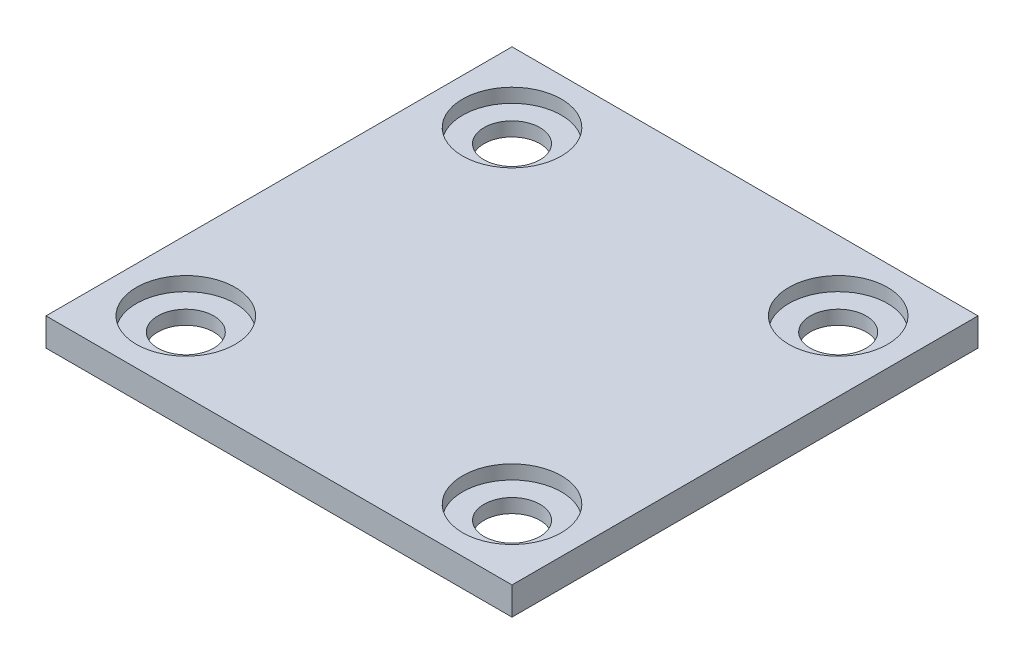
ISO-10303-21;
HEADER;
FILE_DESCRIPTION(('STEP AP214'),'2;1');
FILE_NAME('part.step','',(''),(''),'','','');
FILE_SCHEMA(('AUTOMOTIVE_DESIGN { 1 0 10303 214 1 1 1 1 }'));
ENDSEC;
DATA;
#1=APPLICATION_CONTEXT('core data for automotive mechanical design processes');
#2=APPLICATION_PROTOCOL_DEFINITION('international standard','automotive_design',2000,#1);
#3=PRODUCT_CONTEXT('',#1,'mechanical');
#4=PRODUCT('Part','Part','',(#3));
#5=PRODUCT_RELATED_PRODUCT_CATEGORY('part','',(#4));
#6=PRODUCT_DEFINITION_FORMATION('','',#4);
#7=PRODUCT_DEFINITION_CONTEXT('part definition',#1,'design');
#8=PRODUCT_DEFINITION('design','',#6,#7);
#9=PRODUCT_DEFINITION_SHAPE('','',#8);
#10=(LENGTH_UNIT() NAMED_UNIT(*) SI_UNIT(.MILLI.,.METRE.));
#11=(NAMED_UNIT(*) PLANE_ANGLE_UNIT() SI_UNIT($,.RADIAN.));
#12=(NAMED_UNIT(*) SI_UNIT($,.STERADIAN.) SOLID_ANGLE_UNIT());
#13=UNCERTAINTY_MEASURE_WITH_UNIT(LENGTH_MEASURE(1.E-05),#10,'distance_accuracy_value','');
#14=(GEOMETRIC_REPRESENTATION_CONTEXT(3) GLOBAL_UNCERTAINTY_ASSIGNED_CONTEXT((#13)) GLOBAL_UNIT_ASSIGNED_CONTEXT((#10,
#11,#12)) REPRESENTATION_CONTEXT('',''));
#15=CARTESIAN_POINT('',(0.,0.,0.));
#16=DIRECTION('',(0.,0.,1.));
#17=DIRECTION('',(1.,0.,0.));
#18=AXIS2_PLACEMENT_3D('',#15,#16,#17);
#19=CARTESIAN_POINT('',(-17.5,3.,-17.5));
#20=DIRECTION('',(0.,-1.,0.));
#21=DIRECTION('',(0.,0.,-1.));
#22=AXIS2_PLACEMENT_3D('',#19,#20,#21);
#23=CYLINDRICAL_SURFACE('',#22,3.);
#24=CARTESIAN_POINT('',(-17.5,0.,-17.5));
#25=DIRECTION('',(0.,1.,0.));
#26=DIRECTION('',(0.,0.,1.));
#27=AXIS2_PLACEMENT_3D('',#24,#25,#26);
#28=CIRCLE('',#27,3.);
#29=CARTESIAN_POINT('',(-17.5,0.,-14.5));
#30=VERTEX_POINT('',#29);
#31=EDGE_CURVE('E119',#30,#30,#28,.T.);
#32=ORIENTED_EDGE('',*,*,#31,.F.);
#33=EDGE_LOOP('',(#32));
#34=FACE_BOUND('',#33,.T.);
#35=CARTESIAN_POINT('',(-17.5,1.5,-17.5));
#36=DIRECTION('',(0.,1.,0.));
#37=DIRECTION('',(0.,0.,1.));
#38=AXIS2_PLACEMENT_3D('',#35,#36,#37);
#39=CIRCLE('',#38,3.);
#40=CARTESIAN_POINT('',(-17.5,1.5,-14.5));
#41=VERTEX_POINT('',#40);
#42=EDGE_CURVE('E47',#41,#41,#39,.T.);
#43=ORIENTED_EDGE('',*,*,#42,.T.);
#44=EDGE_LOOP('',(#43));
#45=FACE_BOUND('',#44,.T.);
#46=ADVANCED_FACE('F43',(#34,#45),#23,.F.);
#47=CARTESIAN_POINT('',(17.5,3.,-17.5));
#48=DIRECTION('',(0.,-1.,0.));
#49=DIRECTION('',(0.,0.,-1.));
#50=AXIS2_PLACEMENT_3D('',#47,#48,#49);
#51=CYLINDRICAL_SURFACE('',#50,3.);
#52=CARTESIAN_POINT('',(17.5,0.,-17.5));
#53=DIRECTION('',(0.,1.,0.));
#54=DIRECTION('',(0.,0.,1.));
#55=AXIS2_PLACEMENT_3D('',#52,#53,#54);
#56=CIRCLE('',#55,3.);
#57=CARTESIAN_POINT('',(17.5,0.,-14.5));
#58=VERTEX_POINT('',#57);
#59=EDGE_CURVE('E156',#58,#58,#56,.T.);
#60=ORIENTED_EDGE('',*,*,#59,.F.);
#61=EDGE_LOOP('',(#60));
#62=FACE_BOUND('',#61,.T.);
#63=CARTESIAN_POINT('',(17.5,1.5,-17.5));
#64=DIRECTION('',(0.,1.,0.));
#65=DIRECTION('',(0.,0.,1.));
#66=AXIS2_PLACEMENT_3D('',#63,#64,#65);
#67=CIRCLE('',#66,3.);
#68=CARTESIAN_POINT('',(17.5,1.5,-14.5));
#69=VERTEX_POINT('',#68);
#70=EDGE_CURVE('E138',#69,#69,#67,.T.);
#71=ORIENTED_EDGE('',*,*,#70,.T.);
#72=EDGE_LOOP('',(#71));
#73=FACE_BOUND('',#72,.T.);
#74=ADVANCED_FACE('F174',(#62,#73),#51,.F.);
#75=CARTESIAN_POINT('',(-17.5,3.,17.5));
#76=DIRECTION('',(0.,-1.,0.));
#77=DIRECTION('',(0.,0.,-1.));
#78=AXIS2_PLACEMENT_3D('',#75,#76,#77);
#79=CYLINDRICAL_SURFACE('',#78,3.);
#80=CARTESIAN_POINT('',(-17.5,0.,17.5));
#81=DIRECTION('',(0.,1.,0.));
#82=DIRECTION('',(0.,0.,1.));
#83=AXIS2_PLACEMENT_3D('',#80,#81,#82);
#84=CIRCLE('',#83,3.);
#85=CARTESIAN_POINT('',(-17.5,0.,20.5));
#86=VERTEX_POINT('',#85);
#87=EDGE_CURVE('E150',#86,#86,#84,.T.);
#88=ORIENTED_EDGE('',*,*,#87,.F.);
#89=EDGE_LOOP('',(#88));
#90=FACE_BOUND('',#89,.T.);
#91=CARTESIAN_POINT('',(-17.5,1.5,17.5));
#92=DIRECTION('',(0.,1.,0.));
#93=DIRECTION('',(0.,0.,1.));
#94=AXIS2_PLACEMENT_3D('',#91,#92,#93);
#95=CIRCLE('',#94,3.);
#96=CARTESIAN_POINT('',(-17.5,1.5,20.5));
#97=VERTEX_POINT('',#96);
#98=EDGE_CURVE('E134',#97,#97,#95,.T.);
#99=ORIENTED_EDGE('',*,*,#98,.T.);
#100=EDGE_LOOP('',(#99));
#101=FACE_BOUND('',#100,.T.);
#102=ADVANCED_FACE('F179',(#90,#101),#79,.F.);
#103=CARTESIAN_POINT('',(17.5,3.,17.5));
#104=DIRECTION('',(0.,-1.,0.));
#105=DIRECTION('',(0.,0.,-1.));
#106=AXIS2_PLACEMENT_3D('',#103,#104,#105);
#107=CYLINDRICAL_SURFACE('',#106,3.);
#108=CARTESIAN_POINT('',(17.5,0.,17.5));
#109=DIRECTION('',(0.,1.,0.));
#110=DIRECTION('',(0.,0.,1.));
#111=AXIS2_PLACEMENT_3D('',#108,#109,#110);
#112=CIRCLE('',#111,3.);
#113=CARTESIAN_POINT('',(17.5,0.,20.5));
#114=VERTEX_POINT('',#113);
#115=EDGE_CURVE('E145',#114,#114,#112,.T.);
#116=ORIENTED_EDGE('',*,*,#115,.F.);
#117=EDGE_LOOP('',(#116));
#118=FACE_BOUND('',#117,.T.);
#119=CARTESIAN_POINT('',(17.5,1.5,17.5));
#120=DIRECTION('',(0.,1.,0.));
#121=DIRECTION('',(0.,0.,1.));
#122=AXIS2_PLACEMENT_3D('',#119,#120,#121);
#123=CIRCLE('',#122,3.);
#124=CARTESIAN_POINT('',(17.5,1.5,20.5));
#125=VERTEX_POINT('',#124);
#126=EDGE_CURVE('E130',#125,#125,#123,.T.);
#127=ORIENTED_EDGE('',*,*,#126,.T.);
#128=EDGE_LOOP('',(#127));
#129=FACE_BOUND('',#128,.T.);
#130=ADVANCED_FACE('F186',(#118,#129),#107,.F.);
#131=CARTESIAN_POINT('',(0.,3.,0.));
#132=DIRECTION('',(0.,-1.,0.));
#133=DIRECTION('',(0.,0.,-1.));
#134=AXIS2_PLACEMENT_3D('',#131,#132,#133);
#135=PLANE('',#134);
#136=CARTESIAN_POINT('',(-17.5,3.,17.5));
#137=DIRECTION('',(0.,1.,0.));
#138=DIRECTION('',(0.,0.,1.));
#139=AXIS2_PLACEMENT_3D('',#136,#137,#138);
#140=CIRCLE('',#139,5.3);
#141=CARTESIAN_POINT('',(-17.5,3.,22.8));
#142=VERTEX_POINT('',#141);
#143=EDGE_CURVE('E392',#142,#142,#140,.T.);
#144=ORIENTED_EDGE('',*,*,#143,.F.);
#145=EDGE_LOOP('',(#144));
#146=FACE_BOUND('',#145,.T.);
#147=CARTESIAN_POINT('',(17.5,3.,17.5));
#148=DIRECTION('',(0.,1.,0.));
#149=DIRECTION('',(0.,0.,1.));
#150=AXIS2_PLACEMENT_3D('',#147,#148,#149);
#151=CIRCLE('',#150,5.3);
#152=CARTESIAN_POINT('',(17.5,3.,22.8));
#153=VERTEX_POINT('',#152);
#154=EDGE_CURVE('E400',#153,#153,#151,.T.);
#155=ORIENTED_EDGE('',*,*,#154,.F.);
#156=EDGE_LOOP('',(#155));
#157=FACE_BOUND('',#156,.T.);
#158=CARTESIAN_POINT('',(17.5,3.,-17.5));
#159=DIRECTION('',(0.,1.,0.));
#160=DIRECTION('',(0.,0.,1.));
#161=AXIS2_PLACEMENT_3D('',#158,#159,#160);
#162=CIRCLE('',#161,5.3);
#163=CARTESIAN_POINT('',(17.5,3.,-12.2));
#164=VERTEX_POINT('',#163);
#165=EDGE_CURVE('E386',#164,#164,#162,.T.);
#166=ORIENTED_EDGE('',*,*,#165,.F.);
#167=EDGE_LOOP('',(#166));
#168=FACE_BOUND('',#167,.T.);
#169=CARTESIAN_POINT('',(-17.5,3.,-17.5));
#170=DIRECTION('',(0.,1.,0.));
#171=DIRECTION('',(0.,0.,1.));
#172=AXIS2_PLACEMENT_3D('',#169,#170,#171);
#173=CIRCLE('',#172,5.3);
#174=CARTESIAN_POINT('',(-17.5,3.,-12.2));
#175=VERTEX_POINT('',#174);
#176=EDGE_CURVE('E159',#175,#175,#173,.T.);
#177=ORIENTED_EDGE('',*,*,#176,.F.);
#178=EDGE_LOOP('',(#177));
#179=FACE_BOUND('',#178,.T.);
#180=DIRECTION('',(0.,0.,-1.));
#181=VECTOR('',#180,1.);
#182=CARTESIAN_POINT('',(25.,3.,25.));
#183=LINE('',#182,#181);
#184=CARTESIAN_POINT('',(25.,3.,25.));
#185=VERTEX_POINT('',#184);
#186=CARTESIAN_POINT('',(25.,3.,-25.));
#187=VERTEX_POINT('',#186);
#188=EDGE_CURVE('E98',#185,#187,#183,.T.);
#189=ORIENTED_EDGE('',*,*,#188,.T.);
#190=DIRECTION('',(-1.,0.,0.));
#191=VECTOR('',#190,1.);
#192=CARTESIAN_POINT('',(-25.,3.,-25.));
#193=LINE('',#192,#191);
#194=CARTESIAN_POINT('',(-25.,3.,-25.));
#195=VERTEX_POINT('',#194);
#196=EDGE_CURVE('E93',#187,#195,#193,.T.);
#197=ORIENTED_EDGE('',*,*,#196,.T.);
#198=DIRECTION('',(0.,0.,1.));
#199=VECTOR('',#198,1.);
#200=CARTESIAN_POINT('',(-25.,3.,25.));
#201=LINE('',#200,#199);
#202=CARTESIAN_POINT('',(-25.,3.,25.));
#203=VERTEX_POINT('',#202);
#204=EDGE_CURVE('E96',#195,#203,#201,.T.);
#205=ORIENTED_EDGE('',*,*,#204,.T.);
#206=DIRECTION('',(1.,0.,0.));
#207=VECTOR('',#206,1.);
#208=CARTESIAN_POINT('',(-25.,3.,25.));
#209=LINE('',#208,#207);
#210=EDGE_CURVE('E63',#203,#185,#209,.T.);
#211=ORIENTED_EDGE('',*,*,#210,.T.);
#212=EDGE_LOOP('',(#189,#197,#205,#211));
#213=FACE_BOUND('',#212,.T.);
#214=ADVANCED_FACE('F94',(#146,#157,#168,#179,#213),#135,.F.);
#215=CARTESIAN_POINT('',(0.,0.,0.));
#216=DIRECTION('',(0.,-1.,0.));
#217=DIRECTION('',(0.,0.,-1.));
#218=AXIS2_PLACEMENT_3D('',#215,#216,#217);
#219=PLANE('',#218);
#220=ORIENTED_EDGE('',*,*,#87,.T.);
#221=EDGE_LOOP('',(#220));
#222=FACE_BOUND('',#221,.T.);
#223=ORIENTED_EDGE('',*,*,#31,.T.);
#224=EDGE_LOOP('',(#223));
#225=FACE_BOUND('',#224,.T.);
#226=DIRECTION('',(0.,0.,-1.));
#227=VECTOR('',#226,1.);
#228=CARTESIAN_POINT('',(25.,0.,25.));
#229=LINE('',#228,#227);
#230=CARTESIAN_POINT('',(25.,0.,25.));
#231=VERTEX_POINT('',#230);
#232=CARTESIAN_POINT('',(25.,0.,-25.));
#233=VERTEX_POINT('',#232);
#234=EDGE_CURVE('E115',#231,#233,#229,.T.);
#235=ORIENTED_EDGE('',*,*,#234,.F.);
#236=DIRECTION('',(1.,0.,0.));
#237=VECTOR('',#236,1.);
#238=CARTESIAN_POINT('',(-25.,0.,25.));
#239=LINE('',#238,#237);
#240=CARTESIAN_POINT('',(-25.,0.,25.));
#241=VERTEX_POINT('',#240);
#242=EDGE_CURVE('E86',#241,#231,#239,.T.);
#243=ORIENTED_EDGE('',*,*,#242,.F.);
#244=DIRECTION('',(0.,0.,1.));
#245=VECTOR('',#244,1.);
#246=CARTESIAN_POINT('',(-25.,0.,25.));
#247=LINE('',#246,#245);
#248=CARTESIAN_POINT('',(-25.,0.,-25.));
#249=VERTEX_POINT('',#248);
#250=EDGE_CURVE('E80',#249,#241,#247,.T.);
#251=ORIENTED_EDGE('',*,*,#250,.F.);
#252=DIRECTION('',(-1.,0.,0.));
#253=VECTOR('',#252,1.);
#254=CARTESIAN_POINT('',(-25.,0.,-25.));
#255=LINE('',#254,#253);
#256=EDGE_CURVE('E103',#233,#249,#255,.T.);
#257=ORIENTED_EDGE('',*,*,#256,.F.);
#258=EDGE_LOOP('',(#235,#243,#251,#257));
#259=FACE_BOUND('',#258,.T.);
#260=ORIENTED_EDGE('',*,*,#59,.T.);
#261=EDGE_LOOP('',(#260));
#262=FACE_BOUND('',#261,.T.);
#263=ORIENTED_EDGE('',*,*,#115,.T.);
#264=EDGE_LOOP('',(#263));
#265=FACE_BOUND('',#264,.T.);
#266=ADVANCED_FACE('F170',(#222,#225,#259,#262,#265),#219,.T.);
#267=CARTESIAN_POINT('',(25.,3.,25.));
#268=DIRECTION('',(-1.,0.,0.));
#269=DIRECTION('',(0.,0.,1.));
#270=AXIS2_PLACEMENT_3D('',#267,#268,#269);
#271=PLANE('',#270);
#272=ORIENTED_EDGE('',*,*,#234,.T.);
#273=DIRECTION('',(0.,-1.,0.));
#274=VECTOR('',#273,1.);
#275=CARTESIAN_POINT('',(25.,3.,-25.));
#276=LINE('',#275,#274);
#277=EDGE_CURVE('E11',#187,#233,#276,.T.);
#278=ORIENTED_EDGE('',*,*,#277,.F.);
#279=ORIENTED_EDGE('',*,*,#188,.F.);
#280=DIRECTION('',(0.,-1.,0.));
#281=VECTOR('',#280,1.);
#282=CARTESIAN_POINT('',(25.,3.,25.));
#283=LINE('',#282,#281);
#284=EDGE_CURVE('E111',#185,#231,#283,.T.);
#285=ORIENTED_EDGE('',*,*,#284,.T.);
#286=EDGE_LOOP('',(#272,#278,#279,#285));
#287=FACE_BOUND('',#286,.T.);
#288=ADVANCED_FACE('F45',(#287),#271,.F.);
#289=CARTESIAN_POINT('',(-25.,3.,-25.));
#290=DIRECTION('',(0.,0.,1.));
#291=DIRECTION('',(1.,0.,0.));
#292=AXIS2_PLACEMENT_3D('',#289,#290,#291);
#293=PLANE('',#292);
#294=ORIENTED_EDGE('',*,*,#256,.T.);
#295=DIRECTION('',(0.,-1.,0.));
#296=VECTOR('',#295,1.);
#297=CARTESIAN_POINT('',(-25.,3.,-25.));
#298=LINE('',#297,#296);
#299=EDGE_CURVE('E54',#195,#249,#298,.T.);
#300=ORIENTED_EDGE('',*,*,#299,.F.);
#301=ORIENTED_EDGE('',*,*,#196,.F.);
#302=ORIENTED_EDGE('',*,*,#277,.T.);
#303=EDGE_LOOP('',(#294,#300,#301,#302));
#304=FACE_BOUND('',#303,.T.);
#305=ADVANCED_FACE('F102',(#304),#293,.F.);
#306=CARTESIAN_POINT('',(-25.,3.,25.));
#307=DIRECTION('',(1.,0.,0.));
#308=DIRECTION('',(0.,0.,-1.));
#309=AXIS2_PLACEMENT_3D('',#306,#307,#308);
#310=PLANE('',#309);
#311=ORIENTED_EDGE('',*,*,#250,.T.);
#312=DIRECTION('',(0.,-1.,0.));
#313=VECTOR('',#312,1.);
#314=CARTESIAN_POINT('',(-25.,3.,25.));
#315=LINE('',#314,#313);
#316=EDGE_CURVE('E105',#203,#241,#315,.T.);
#317=ORIENTED_EDGE('',*,*,#316,.F.);
#318=ORIENTED_EDGE('',*,*,#204,.F.);
#319=ORIENTED_EDGE('',*,*,#299,.T.);
#320=EDGE_LOOP('',(#311,#317,#318,#319));
#321=FACE_BOUND('',#320,.T.);
#322=ADVANCED_FACE('F107',(#321),#310,.F.);
#323=CARTESIAN_POINT('',(-25.,3.,25.));
#324=DIRECTION('',(0.,0.,-1.));
#325=DIRECTION('',(-1.,0.,0.));
#326=AXIS2_PLACEMENT_3D('',#323,#324,#325);
#327=PLANE('',#326);
#328=ORIENTED_EDGE('',*,*,#242,.T.);
#329=ORIENTED_EDGE('',*,*,#284,.F.);
#330=ORIENTED_EDGE('',*,*,#210,.F.);
#331=ORIENTED_EDGE('',*,*,#316,.T.);
#332=EDGE_LOOP('',(#328,#329,#330,#331));
#333=FACE_BOUND('',#332,.T.);
#334=ADVANCED_FACE('F191',(#333),#327,.F.);
#335=CARTESIAN_POINT('',(17.5,1.5,17.5));
#336=DIRECTION('',(0.,1.,0.));
#337=DIRECTION('',(0.,0.,1.));
#338=AXIS2_PLACEMENT_3D('',#335,#336,#337);
#339=CYLINDRICAL_SURFACE('',#338,5.3);
#340=CARTESIAN_POINT('',(17.5,1.5,17.5));
#341=DIRECTION('',(0.,1.,0.));
#342=DIRECTION('',(0.,0.,1.));
#343=AXIS2_PLACEMENT_3D('',#340,#341,#342);
#344=CIRCLE('',#343,5.3);
#345=CARTESIAN_POINT('',(17.5,1.5,22.8));
#346=VERTEX_POINT('',#345);
#347=EDGE_CURVE('E396',#346,#346,#344,.T.);
#348=ORIENTED_EDGE('',*,*,#347,.F.);
#349=EDGE_LOOP('',(#348));
#350=FACE_BOUND('',#349,.T.);
#351=ORIENTED_EDGE('',*,*,#154,.T.);
#352=EDGE_LOOP('',(#351));
#353=FACE_BOUND('',#352,.T.);
#354=ADVANCED_FACE('F194',(#350,#353),#339,.F.);
#355=CARTESIAN_POINT('',(17.5,1.5,17.5));
#356=DIRECTION('',(0.,1.,0.));
#357=DIRECTION('',(0.,0.,1.));
#358=AXIS2_PLACEMENT_3D('',#355,#356,#357);
#359=PLANE('',#358);
#360=ORIENTED_EDGE('',*,*,#126,.F.);
#361=EDGE_LOOP('',(#360));
#362=FACE_BOUND('',#361,.T.);
#363=ORIENTED_EDGE('',*,*,#347,.T.);
#364=EDGE_LOOP('',(#363));
#365=FACE_BOUND('',#364,.T.);
#366=ADVANCED_FACE('F292',(#362,#365),#359,.T.);
#367=CARTESIAN_POINT('',(-17.5,1.5,17.5));
#368=DIRECTION('',(0.,1.,0.));
#369=DIRECTION('',(0.,0.,1.));
#370=AXIS2_PLACEMENT_3D('',#367,#368,#369);
#371=CYLINDRICAL_SURFACE('',#370,5.3);
#372=CARTESIAN_POINT('',(-17.5,1.5,17.5));
#373=DIRECTION('',(0.,1.,0.));
#374=DIRECTION('',(0.,0.,1.));
#375=AXIS2_PLACEMENT_3D('',#372,#373,#374);
#376=CIRCLE('',#375,5.3);
#377=CARTESIAN_POINT('',(-17.5,1.5,22.8));
#378=VERTEX_POINT('',#377);
#379=EDGE_CURVE('E388',#378,#378,#376,.T.);
#380=ORIENTED_EDGE('',*,*,#379,.F.);
#381=EDGE_LOOP('',(#380));
#382=FACE_BOUND('',#381,.T.);
#383=ORIENTED_EDGE('',*,*,#143,.T.);
#384=EDGE_LOOP('',(#383));
#385=FACE_BOUND('',#384,.T.);
#386=ADVANCED_FACE('F303',(#382,#385),#371,.F.);
#387=CARTESIAN_POINT('',(-17.5,1.5,17.5));
#388=DIRECTION('',(0.,1.,0.));
#389=DIRECTION('',(0.,0.,1.));
#390=AXIS2_PLACEMENT_3D('',#387,#388,#389);
#391=PLANE('',#390);
#392=ORIENTED_EDGE('',*,*,#98,.F.);
#393=EDGE_LOOP('',(#392));
#394=FACE_BOUND('',#393,.T.);
#395=ORIENTED_EDGE('',*,*,#379,.T.);
#396=EDGE_LOOP('',(#395));
#397=FACE_BOUND('',#396,.T.);
#398=ADVANCED_FACE('F314',(#394,#397),#391,.T.);
#399=CARTESIAN_POINT('',(17.5,1.5,-17.5));
#400=DIRECTION('',(0.,1.,0.));
#401=DIRECTION('',(0.,0.,1.));
#402=AXIS2_PLACEMENT_3D('',#399,#400,#401);
#403=CYLINDRICAL_SURFACE('',#402,5.3);
#404=CARTESIAN_POINT('',(17.5,1.5,-17.5));
#405=DIRECTION('',(0.,1.,0.));
#406=DIRECTION('',(0.,0.,1.));
#407=AXIS2_PLACEMENT_3D('',#404,#405,#406);
#408=CIRCLE('',#407,5.3);
#409=CARTESIAN_POINT('',(17.5,1.5,-12.2));
#410=VERTEX_POINT('',#409);
#411=EDGE_CURVE('E404',#410,#410,#408,.T.);
#412=ORIENTED_EDGE('',*,*,#411,.F.);
#413=EDGE_LOOP('',(#412));
#414=FACE_BOUND('',#413,.T.);
#415=ORIENTED_EDGE('',*,*,#165,.T.);
#416=EDGE_LOOP('',(#415));
#417=FACE_BOUND('',#416,.T.);
#418=ADVANCED_FACE('F325',(#414,#417),#403,.F.);
#419=CARTESIAN_POINT('',(17.5,1.5,-17.5));
#420=DIRECTION('',(0.,1.,0.));
#421=DIRECTION('',(0.,0.,1.));
#422=AXIS2_PLACEMENT_3D('',#419,#420,#421);
#423=PLANE('',#422);
#424=ORIENTED_EDGE('',*,*,#70,.F.);
#425=EDGE_LOOP('',(#424));
#426=FACE_BOUND('',#425,.T.);
#427=ORIENTED_EDGE('',*,*,#411,.T.);
#428=EDGE_LOOP('',(#427));
#429=FACE_BOUND('',#428,.T.);
#430=ADVANCED_FACE('F336',(#426,#429),#423,.T.);
#431=CARTESIAN_POINT('',(-17.5,1.5,-17.5));
#432=DIRECTION('',(0.,1.,0.));
#433=DIRECTION('',(0.,0.,1.));
#434=AXIS2_PLACEMENT_3D('',#431,#432,#433);
#435=CYLINDRICAL_SURFACE('',#434,5.3);
#436=CARTESIAN_POINT('',(-17.5,1.5,-17.5));
#437=DIRECTION('',(0.,1.,0.));
#438=DIRECTION('',(0.,0.,1.));
#439=AXIS2_PLACEMENT_3D('',#436,#437,#438);
#440=CIRCLE('',#439,5.3);
#441=CARTESIAN_POINT('',(-17.5,1.5,-12.2));
#442=VERTEX_POINT('',#441);
#443=EDGE_CURVE('E135',#442,#442,#440,.T.);
#444=ORIENTED_EDGE('',*,*,#443,.F.);
#445=EDGE_LOOP('',(#444));
#446=FACE_BOUND('',#445,.T.);
#447=ORIENTED_EDGE('',*,*,#176,.T.);
#448=EDGE_LOOP('',(#447));
#449=FACE_BOUND('',#448,.T.);
#450=ADVANCED_FACE('F347',(#446,#449),#435,.F.);
#451=CARTESIAN_POINT('',(-17.5,1.5,-17.5));
#452=DIRECTION('',(0.,1.,0.));
#453=DIRECTION('',(0.,0.,1.));
#454=AXIS2_PLACEMENT_3D('',#451,#452,#453);
#455=PLANE('',#454);
#456=ORIENTED_EDGE('',*,*,#42,.F.);
#457=EDGE_LOOP('',(#456));
#458=FACE_BOUND('',#457,.T.);
#459=ORIENTED_EDGE('',*,*,#443,.T.);
#460=EDGE_LOOP('',(#459));
#461=FACE_BOUND('',#460,.T.);
#462=ADVANCED_FACE('F358',(#458,#461),#455,.T.);
#463=CLOSED_SHELL('',(#46,#74,#102,#130,#214,#266,#288,#305,#322,#334,#354,#366,#386,#398,#418,
#430,#450,#462));
#464=MANIFOLD_SOLID_BREP('B2',#463);
#465=ADVANCED_BREP_SHAPE_REPRESENTATION('',(#18,#464),#14);
#466=SHAPE_DEFINITION_REPRESENTATION(#9,#465);
ENDSEC;
END-ISO-10303-21;
